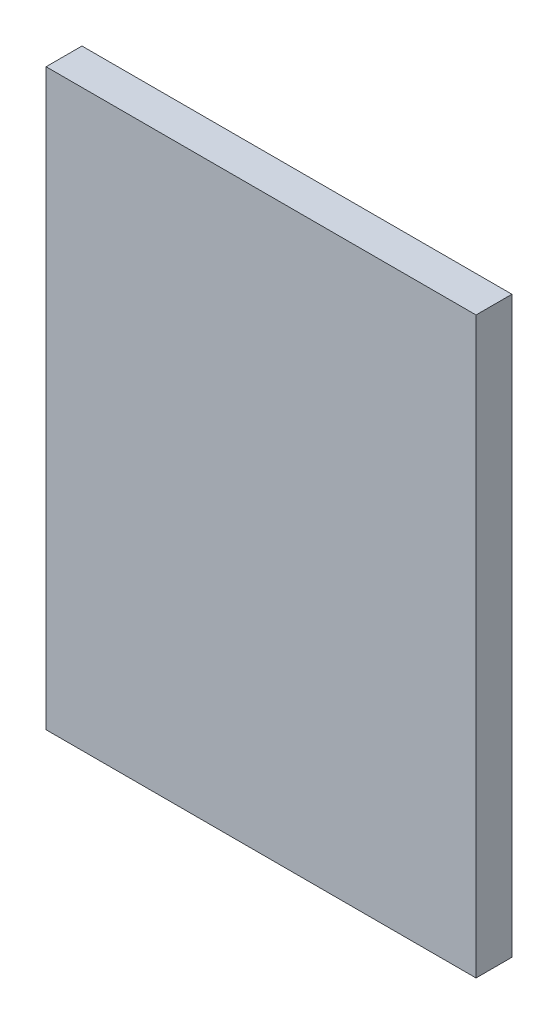
ISO-10303-21;
HEADER;
FILE_DESCRIPTION(('STEP AP214'),'2;1');
FILE_NAME('part.step','',(''),(''),'','','');
FILE_SCHEMA(('AUTOMOTIVE_DESIGN { 1 0 10303 214 1 1 1 1 }'));
ENDSEC;
DATA;
#1=APPLICATION_CONTEXT('core data for automotive mechanical design processes');
#2=APPLICATION_PROTOCOL_DEFINITION('international standard','automotive_design',2000,#1);
#3=PRODUCT_CONTEXT('',#1,'mechanical');
#4=PRODUCT('Part','Part','',(#3));
#5=PRODUCT_RELATED_PRODUCT_CATEGORY('part','',(#4));
#6=PRODUCT_DEFINITION_FORMATION('','',#4);
#7=PRODUCT_DEFINITION_CONTEXT('part definition',#1,'design');
#8=PRODUCT_DEFINITION('design','',#6,#7);
#9=PRODUCT_DEFINITION_SHAPE('','',#8);
#10=(LENGTH_UNIT() NAMED_UNIT(*) SI_UNIT(.MILLI.,.METRE.));
#11=(NAMED_UNIT(*) PLANE_ANGLE_UNIT() SI_UNIT($,.RADIAN.));
#12=(NAMED_UNIT(*) SI_UNIT($,.STERADIAN.) SOLID_ANGLE_UNIT());
#13=UNCERTAINTY_MEASURE_WITH_UNIT(LENGTH_MEASURE(1.E-05),#10,'distance_accuracy_value','');
#14=(GEOMETRIC_REPRESENTATION_CONTEXT(3) GLOBAL_UNCERTAINTY_ASSIGNED_CONTEXT((#13)) GLOBAL_UNIT_ASSIGNED_CONTEXT((#10,
#11,#12)) REPRESENTATION_CONTEXT('',''));
#15=CARTESIAN_POINT('',(0.,0.,0.));
#16=DIRECTION('',(0.,0.,1.));
#17=DIRECTION('',(1.,0.,0.));
#18=AXIS2_PLACEMENT_3D('',#15,#16,#17);
#19=CARTESIAN_POINT('',(38.03777,-50.8,6.35));
#20=DIRECTION('',(-1.,0.,0.));
#21=DIRECTION('',(0.,0.,1.));
#22=AXIS2_PLACEMENT_3D('',#19,#20,#21);
#23=PLANE('',#22);
#24=DIRECTION('',(0.,1.,0.));
#25=VECTOR('',#24,1.);
#26=CARTESIAN_POINT('',(38.03777,-50.8,0.));
#27=LINE('',#26,#25);
#28=CARTESIAN_POINT('',(38.03777,-50.8,0.));
#29=VERTEX_POINT('',#28);
#30=CARTESIAN_POINT('',(38.03777,50.8,0.));
#31=VERTEX_POINT('',#30);
#32=EDGE_CURVE('E104',#29,#31,#27,.T.);
#33=ORIENTED_EDGE('',*,*,#32,.T.);
#34=DIRECTION('',(0.,0.,-1.));
#35=VECTOR('',#34,1.);
#36=CARTESIAN_POINT('',(38.03777,50.8,6.35));
#37=LINE('',#36,#35);
#38=CARTESIAN_POINT('',(38.03777,50.8,6.35));
#39=VERTEX_POINT('',#38);
#40=EDGE_CURVE('E11',#39,#31,#37,.T.);
#41=ORIENTED_EDGE('',*,*,#40,.F.);
#42=DIRECTION('',(0.,1.,0.));
#43=VECTOR('',#42,1.);
#44=CARTESIAN_POINT('',(38.03777,-50.8,6.35));
#45=LINE('',#44,#43);
#46=CARTESIAN_POINT('',(38.03777,-50.8,6.35));
#47=VERTEX_POINT('',#46);
#48=EDGE_CURVE('E92',#47,#39,#45,.T.);
#49=ORIENTED_EDGE('',*,*,#48,.F.);
#50=DIRECTION('',(0.,0.,-1.));
#51=VECTOR('',#50,1.);
#52=CARTESIAN_POINT('',(38.03777,-50.8,6.35));
#53=LINE('',#52,#51);
#54=EDGE_CURVE('E100',#47,#29,#53,.T.);
#55=ORIENTED_EDGE('',*,*,#54,.T.);
#56=EDGE_LOOP('',(#33,#41,#49,#55));
#57=FACE_BOUND('',#56,.T.);
#58=ADVANCED_FACE('F41',(#57),#23,.F.);
#59=CARTESIAN_POINT('',(-38.03777,50.8,6.35));
#60=DIRECTION('',(0.,-1.,0.));
#61=DIRECTION('',(0.,0.,-1.));
#62=AXIS2_PLACEMENT_3D('',#59,#60,#61);
#63=PLANE('',#62);
#64=DIRECTION('',(-1.,0.,0.));
#65=VECTOR('',#64,1.);
#66=CARTESIAN_POINT('',(-38.03777,50.8,0.));
#67=LINE('',#66,#65);
#68=CARTESIAN_POINT('',(-38.03777,50.8,0.));
#69=VERTEX_POINT('',#68);
#70=EDGE_CURVE('E96',#31,#69,#67,.T.);
#71=ORIENTED_EDGE('',*,*,#70,.T.);
#72=DIRECTION('',(0.,0.,-1.));
#73=VECTOR('',#72,1.);
#74=CARTESIAN_POINT('',(-38.03777,50.8,6.35));
#75=LINE('',#74,#73);
#76=CARTESIAN_POINT('',(-38.03777,50.8,6.35));
#77=VERTEX_POINT('',#76);
#78=EDGE_CURVE('E49',#77,#69,#75,.T.);
#79=ORIENTED_EDGE('',*,*,#78,.F.);
#80=DIRECTION('',(-1.,0.,0.));
#81=VECTOR('',#80,1.);
#82=CARTESIAN_POINT('',(-38.03777,50.8,6.35));
#83=LINE('',#82,#81);
#84=EDGE_CURVE('E87',#39,#77,#83,.T.);
#85=ORIENTED_EDGE('',*,*,#84,.F.);
#86=ORIENTED_EDGE('',*,*,#40,.T.);
#87=EDGE_LOOP('',(#71,#79,#85,#86));
#88=FACE_BOUND('',#87,.T.);
#89=ADVANCED_FACE('F95',(#88),#63,.F.);
#90=CARTESIAN_POINT('',(-38.03777,-50.8,6.35));
#91=DIRECTION('',(1.,0.,0.));
#92=DIRECTION('',(0.,0.,-1.));
#93=AXIS2_PLACEMENT_3D('',#90,#91,#92);
#94=PLANE('',#93);
#95=DIRECTION('',(0.,-1.,0.));
#96=VECTOR('',#95,1.);
#97=CARTESIAN_POINT('',(-38.03777,-50.8,0.));
#98=LINE('',#97,#96);
#99=CARTESIAN_POINT('',(-38.03777,-50.8,0.));
#100=VERTEX_POINT('',#99);
#101=EDGE_CURVE('E74',#69,#100,#98,.T.);
#102=ORIENTED_EDGE('',*,*,#101,.T.);
#103=DIRECTION('',(0.,0.,-1.));
#104=VECTOR('',#103,1.);
#105=CARTESIAN_POINT('',(-38.03777,-50.8,6.35));
#106=LINE('',#105,#104);
#107=CARTESIAN_POINT('',(-38.03777,-50.8,6.35));
#108=VERTEX_POINT('',#107);
#109=EDGE_CURVE('E97',#108,#100,#106,.T.);
#110=ORIENTED_EDGE('',*,*,#109,.F.);
#111=DIRECTION('',(0.,-1.,0.));
#112=VECTOR('',#111,1.);
#113=CARTESIAN_POINT('',(-38.03777,-50.8,6.35));
#114=LINE('',#113,#112);
#115=EDGE_CURVE('E90',#77,#108,#114,.T.);
#116=ORIENTED_EDGE('',*,*,#115,.F.);
#117=ORIENTED_EDGE('',*,*,#78,.T.);
#118=EDGE_LOOP('',(#102,#110,#116,#117));
#119=FACE_BOUND('',#118,.T.);
#120=ADVANCED_FACE('F98',(#119),#94,.F.);
#121=CARTESIAN_POINT('',(-38.03777,-50.8,6.35));
#122=DIRECTION('',(0.,1.,0.));
#123=DIRECTION('',(0.,0.,1.));
#124=AXIS2_PLACEMENT_3D('',#121,#122,#123);
#125=PLANE('',#124);
#126=DIRECTION('',(1.,0.,0.));
#127=VECTOR('',#126,1.);
#128=CARTESIAN_POINT('',(-38.03777,-50.8,0.));
#129=LINE('',#128,#127);
#130=EDGE_CURVE('E80',#100,#29,#129,.T.);
#131=ORIENTED_EDGE('',*,*,#130,.T.);
#132=ORIENTED_EDGE('',*,*,#54,.F.);
#133=DIRECTION('',(1.,0.,0.));
#134=VECTOR('',#133,1.);
#135=CARTESIAN_POINT('',(-38.03777,-50.8,6.35));
#136=LINE('',#135,#134);
#137=EDGE_CURVE('E57',#108,#47,#136,.T.);
#138=ORIENTED_EDGE('',*,*,#137,.F.);
#139=ORIENTED_EDGE('',*,*,#109,.T.);
#140=EDGE_LOOP('',(#131,#132,#138,#139));
#141=FACE_BOUND('',#140,.T.);
#142=ADVANCED_FACE('F111',(#141),#125,.F.);
#143=CARTESIAN_POINT('',(0.,0.,6.35));
#144=DIRECTION('',(0.,0.,-1.));
#145=DIRECTION('',(-1.,0.,0.));
#146=AXIS2_PLACEMENT_3D('',#143,#144,#145);
#147=PLANE('',#146);
#148=ORIENTED_EDGE('',*,*,#48,.T.);
#149=ORIENTED_EDGE('',*,*,#84,.T.);
#150=ORIENTED_EDGE('',*,*,#115,.T.);
#151=ORIENTED_EDGE('',*,*,#137,.T.);
#152=EDGE_LOOP('',(#148,#149,#150,#151));
#153=FACE_BOUND('',#152,.T.);
#154=ADVANCED_FACE('F88',(#153),#147,.F.);
#155=CARTESIAN_POINT('',(0.,0.,0.));
#156=DIRECTION('',(0.,0.,-1.));
#157=DIRECTION('',(-1.,0.,0.));
#158=AXIS2_PLACEMENT_3D('',#155,#156,#157);
#159=PLANE('',#158);
#160=ORIENTED_EDGE('',*,*,#32,.F.);
#161=ORIENTED_EDGE('',*,*,#130,.F.);
#162=ORIENTED_EDGE('',*,*,#101,.F.);
#163=ORIENTED_EDGE('',*,*,#70,.F.);
#164=EDGE_LOOP('',(#160,#161,#162,#163));
#165=FACE_BOUND('',#164,.T.);
#166=ADVANCED_FACE('F114',(#165),#159,.T.);
#167=CLOSED_SHELL('',(#58,#89,#120,#142,#154,#166));
#168=MANIFOLD_SOLID_BREP('B2',#167);
#169=ADVANCED_BREP_SHAPE_REPRESENTATION('',(#18,#168),#14);
#170=SHAPE_DEFINITION_REPRESENTATION(#9,#169);
ENDSEC;
END-ISO-10303-21;
